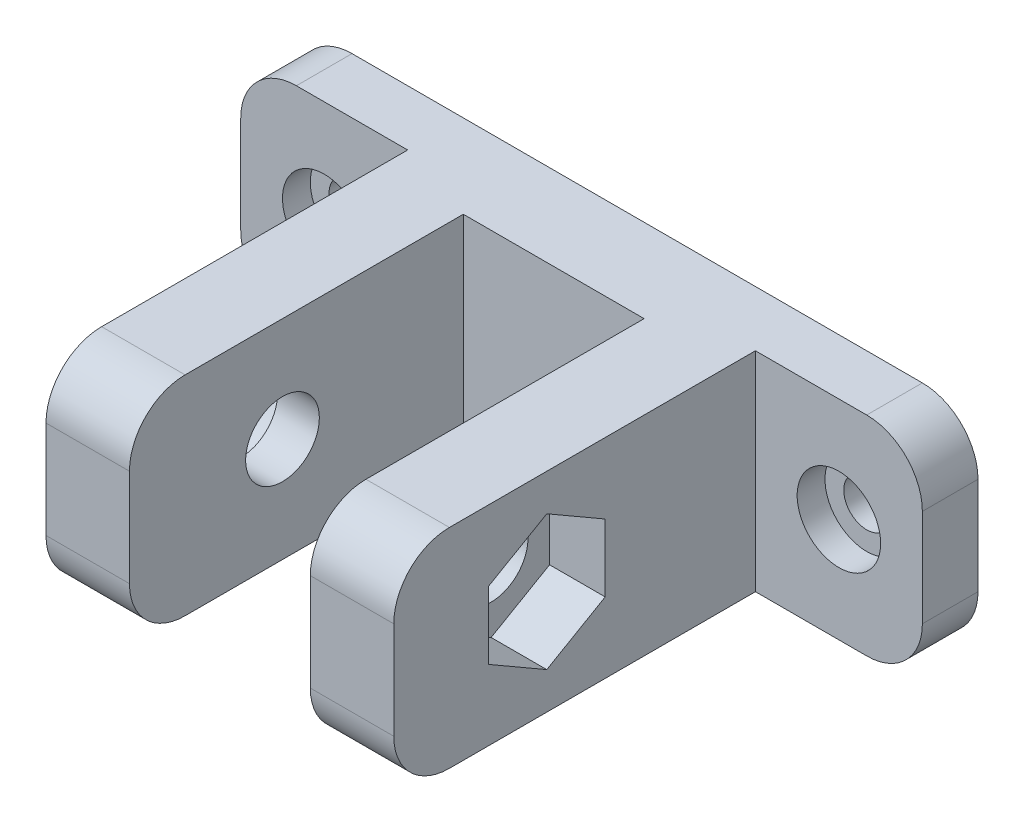
ISO-10303-21;
HEADER;
FILE_DESCRIPTION(('STEP AP214'),'2;1');
FILE_NAME('part.step','',(''),(''),'','','');
FILE_SCHEMA(('AUTOMOTIVE_DESIGN { 1 0 10303 214 1 1 1 1 }'));
ENDSEC;
DATA;
#1=APPLICATION_CONTEXT('core data for automotive mechanical design processes');
#2=APPLICATION_PROTOCOL_DEFINITION('international standard','automotive_design',2000,#1);
#3=PRODUCT_CONTEXT('',#1,'mechanical');
#4=PRODUCT('Part','Part','',(#3));
#5=PRODUCT_RELATED_PRODUCT_CATEGORY('part','',(#4));
#6=PRODUCT_DEFINITION_FORMATION('','',#4);
#7=PRODUCT_DEFINITION_CONTEXT('part definition',#1,'design');
#8=PRODUCT_DEFINITION('design','',#6,#7);
#9=PRODUCT_DEFINITION_SHAPE('','',#8);
#10=(LENGTH_UNIT() NAMED_UNIT(*) SI_UNIT(.MILLI.,.METRE.));
#11=(NAMED_UNIT(*) PLANE_ANGLE_UNIT() SI_UNIT($,.RADIAN.));
#12=(NAMED_UNIT(*) SI_UNIT($,.STERADIAN.) SOLID_ANGLE_UNIT());
#13=UNCERTAINTY_MEASURE_WITH_UNIT(LENGTH_MEASURE(1.E-05),#10,'distance_accuracy_value','');
#14=(GEOMETRIC_REPRESENTATION_CONTEXT(3) GLOBAL_UNCERTAINTY_ASSIGNED_CONTEXT((#13)) GLOBAL_UNIT_ASSIGNED_CONTEXT((#10,
#11,#12)) REPRESENTATION_CONTEXT('',''));
#15=CARTESIAN_POINT('',(0.,0.,0.));
#16=DIRECTION('',(0.,0.,1.));
#17=DIRECTION('',(1.,0.,0.));
#18=AXIS2_PLACEMENT_3D('',#15,#16,#17);
#19=CARTESIAN_POINT('',(12.5,-185.,30.7200156897307));
#20=DIRECTION('',(1.,0.,0.));
#21=DIRECTION('',(0.,0.,-1.));
#22=AXIS2_PLACEMENT_3D('',#19,#20,#21);
#23=PLANE('',#22);
#24=DIRECTION('',(0.,-1.,0.));
#25=VECTOR('',#24,1.);
#26=CARTESIAN_POINT('',(12.5,-185.,45.));
#27=LINE('',#26,#25);
#28=CARTESIAN_POINT('',(12.5,-189.,45.));
#29=VERTEX_POINT('',#28);
#30=CARTESIAN_POINT('',(12.5,-196.,45.));
#31=VERTEX_POINT('',#30);
#32=EDGE_CURVE('E456',#29,#31,#27,.T.);
#33=ORIENTED_EDGE('',*,*,#32,.T.);
#34=CARTESIAN_POINT('',(12.5,-196.,41.));
#35=DIRECTION('',(1.,0.,0.));
#36=DIRECTION('',(0.,0.,-1.));
#37=AXIS2_PLACEMENT_3D('',#34,#35,#36);
#38=CIRCLE('',#37,4.);
#39=CARTESIAN_POINT('',(12.5,-200.,41.));
#40=VERTEX_POINT('',#39);
#41=EDGE_CURVE('E509',#31,#40,#38,.T.);
#42=ORIENTED_EDGE('',*,*,#41,.T.);
#43=DIRECTION('',(0.,0.,1.));
#44=VECTOR('',#43,1.);
#45=CARTESIAN_POINT('',(12.5,-200.,30.7200156897307));
#46=LINE('',#45,#44);
#47=CARTESIAN_POINT('',(12.5,-200.,19.));
#48=VERTEX_POINT('',#47);
#49=EDGE_CURVE('E431',#48,#40,#46,.T.);
#50=ORIENTED_EDGE('',*,*,#49,.F.);
#51=DIRECTION('',(0.,-1.,0.));
#52=VECTOR('',#51,1.);
#53=CARTESIAN_POINT('',(12.5,-185.,19.));
#54=LINE('',#53,#52);
#55=CARTESIAN_POINT('',(12.5,-185.,19.));
#56=VERTEX_POINT('',#55);
#57=EDGE_CURVE('E447',#56,#48,#54,.T.);
#58=ORIENTED_EDGE('',*,*,#57,.F.);
#59=DIRECTION('',(0.,0.,1.));
#60=VECTOR('',#59,1.);
#61=CARTESIAN_POINT('',(12.5,-185.,30.7200156897307));
#62=LINE('',#61,#60);
#63=CARTESIAN_POINT('',(12.5,-185.,41.));
#64=VERTEX_POINT('',#63);
#65=EDGE_CURVE('E400',#56,#64,#62,.T.);
#66=ORIENTED_EDGE('',*,*,#65,.T.);
#67=CARTESIAN_POINT('',(12.5,-189.,41.));
#68=DIRECTION('',(1.,0.,0.));
#69=DIRECTION('',(0.,0.,-1.));
#70=AXIS2_PLACEMENT_3D('',#67,#68,#69);
#71=CIRCLE('',#70,4.);
#72=EDGE_CURVE('E506',#64,#29,#71,.T.);
#73=ORIENTED_EDGE('',*,*,#72,.T.);
#74=EDGE_LOOP('',(#33,#42,#50,#58,#66,#73));
#75=FACE_BOUND('',#74,.T.);
#76=DIRECTION('',(0.,-0.5,0.866025403784438));
#77=VECTOR('',#76,1.);
#78=CARTESIAN_POINT('',(12.5,-196.137306695894,31.9));
#79=LINE('',#78,#77);
#80=CARTESIAN_POINT('',(12.5,-194.924871130597,29.8));
#81=VERTEX_POINT('',#80);
#82=CARTESIAN_POINT('',(12.5,-197.349742261193,34.));
#83=VERTEX_POINT('',#82);
#84=EDGE_CURVE('E303',#81,#83,#79,.T.);
#85=ORIENTED_EDGE('',*,*,#84,.T.);
#86=DIRECTION('',(0.,0.5,0.866025403784439));
#87=VECTOR('',#86,1.);
#88=CARTESIAN_POINT('',(12.5,-196.137306695894,36.1));
#89=LINE('',#88,#87);
#90=CARTESIAN_POINT('',(12.5,-194.924871130597,38.2));
#91=VERTEX_POINT('',#90);
#92=EDGE_CURVE('E253',#83,#91,#89,.T.);
#93=ORIENTED_EDGE('',*,*,#92,.T.);
#94=DIRECTION('',(0.,1.,0.));
#95=VECTOR('',#94,1.);
#96=CARTESIAN_POINT('',(12.5,-192.5,38.2));
#97=LINE('',#96,#95);
#98=CARTESIAN_POINT('',(12.5,-190.075128869403,38.2));
#99=VERTEX_POINT('',#98);
#100=EDGE_CURVE('E277',#91,#99,#97,.T.);
#101=ORIENTED_EDGE('',*,*,#100,.T.);
#102=DIRECTION('',(0.,0.5,-0.866025403784438));
#103=VECTOR('',#102,1.);
#104=CARTESIAN_POINT('',(12.5,-188.862693304105,36.1));
#105=LINE('',#104,#103);
#106=CARTESIAN_POINT('',(12.5,-187.650257738807,34.));
#107=VERTEX_POINT('',#106);
#108=EDGE_CURVE('E37',#99,#107,#105,.T.);
#109=ORIENTED_EDGE('',*,*,#108,.T.);
#110=DIRECTION('',(0.,-0.5,-0.866025403784439));
#111=VECTOR('',#110,1.);
#112=CARTESIAN_POINT('',(12.5,-188.862693304105,31.9));
#113=LINE('',#112,#111);
#114=CARTESIAN_POINT('',(12.5,-190.075128869403,29.8));
#115=VERTEX_POINT('',#114);
#116=EDGE_CURVE('E310',#107,#115,#113,.T.);
#117=ORIENTED_EDGE('',*,*,#116,.T.);
#118=DIRECTION('',(0.,-1.,0.));
#119=VECTOR('',#118,1.);
#120=CARTESIAN_POINT('',(12.5,-192.5,29.8));
#121=LINE('',#120,#119);
#122=EDGE_CURVE('E306',#115,#81,#121,.T.);
#123=ORIENTED_EDGE('',*,*,#122,.T.);
#124=EDGE_LOOP('',(#85,#93,#101,#109,#117,#123));
#125=FACE_BOUND('',#124,.T.);
#126=ADVANCED_FACE('F16',(#75,#125),#23,.T.);
#127=CARTESIAN_POINT('',(12.502,-192.5,34.));
#128=DIRECTION('',(-1.,0.,0.));
#129=DIRECTION('',(0.,0.,1.));
#130=AXIS2_PLACEMENT_3D('',#127,#128,#129);
#131=CYLINDRICAL_SURFACE('',#130,2.65);
#132=CARTESIAN_POINT('',(6.5,-192.5,34.));
#133=DIRECTION('',(1.,0.,0.));
#134=DIRECTION('',(0.,0.,-1.));
#135=AXIS2_PLACEMENT_3D('',#132,#133,#134);
#136=CIRCLE('',#135,2.65);
#137=CARTESIAN_POINT('',(6.5,-192.5,31.35));
#138=VERTEX_POINT('',#137);
#139=EDGE_CURVE('E367',#138,#138,#136,.T.);
#140=ORIENTED_EDGE('',*,*,#139,.F.);
#141=EDGE_LOOP('',(#140));
#142=FACE_BOUND('',#141,.T.);
#143=CARTESIAN_POINT('',(8.5,-192.5,34.));
#144=DIRECTION('',(1.,0.,0.));
#145=DIRECTION('',(0.,0.,-1.));
#146=AXIS2_PLACEMENT_3D('',#143,#144,#145);
#147=CIRCLE('',#146,2.65);
#148=CARTESIAN_POINT('',(8.5,-192.5,31.35));
#149=VERTEX_POINT('',#148);
#150=EDGE_CURVE('E298',#149,#149,#147,.F.);
#151=ORIENTED_EDGE('',*,*,#150,.F.);
#152=EDGE_LOOP('',(#151));
#153=FACE_BOUND('',#152,.T.);
#154=ADVANCED_FACE('F679',(#142,#153),#131,.F.);
#155=CARTESIAN_POINT('',(-18.5,-192.5,14.998));
#156=DIRECTION('',(0.,0.,1.));
#157=DIRECTION('',(1.,0.,0.));
#158=AXIS2_PLACEMENT_3D('',#155,#156,#157);
#159=CYLINDRICAL_SURFACE('',#158,1.65);
#160=CARTESIAN_POINT('',(-18.5,-192.5,15.));
#161=DIRECTION('',(0.,0.,1.));
#162=DIRECTION('',(1.,0.,0.));
#163=AXIS2_PLACEMENT_3D('',#160,#161,#162);
#164=CIRCLE('',#163,1.65);
#165=CARTESIAN_POINT('',(-16.85,-192.5,15.));
#166=VERTEX_POINT('',#165);
#167=EDGE_CURVE('E352',#166,#166,#164,.F.);
#168=ORIENTED_EDGE('',*,*,#167,.T.);
#169=EDGE_LOOP('',(#168));
#170=FACE_BOUND('',#169,.T.);
#171=CARTESIAN_POINT('',(-18.5,-192.5,17.));
#172=DIRECTION('',(0.,0.,1.));
#173=DIRECTION('',(1.,0.,0.));
#174=AXIS2_PLACEMENT_3D('',#171,#172,#173);
#175=CIRCLE('',#174,1.65);
#176=CARTESIAN_POINT('',(-16.85,-192.5,17.));
#177=VERTEX_POINT('',#176);
#178=EDGE_CURVE('E328',#177,#177,#175,.T.);
#179=ORIENTED_EDGE('',*,*,#178,.T.);
#180=EDGE_LOOP('',(#179));
#181=FACE_BOUND('',#180,.T.);
#182=ADVANCED_FACE('F684',(#170,#181),#159,.F.);
#183=CARTESIAN_POINT('',(18.5,-192.5,14.998));
#184=DIRECTION('',(0.,0.,1.));
#185=DIRECTION('',(1.,0.,0.));
#186=AXIS2_PLACEMENT_3D('',#183,#184,#185);
#187=CYLINDRICAL_SURFACE('',#186,1.65);
#188=CARTESIAN_POINT('',(18.5,-192.5,15.));
#189=DIRECTION('',(0.,0.,1.));
#190=DIRECTION('',(1.,0.,0.));
#191=AXIS2_PLACEMENT_3D('',#188,#189,#190);
#192=CIRCLE('',#191,1.65);
#193=CARTESIAN_POINT('',(20.15,-192.5,15.));
#194=VERTEX_POINT('',#193);
#195=EDGE_CURVE('E337',#194,#194,#192,.F.);
#196=ORIENTED_EDGE('',*,*,#195,.T.);
#197=EDGE_LOOP('',(#196));
#198=FACE_BOUND('',#197,.T.);
#199=CARTESIAN_POINT('',(18.5,-192.5,17.));
#200=DIRECTION('',(0.,0.,1.));
#201=DIRECTION('',(1.,0.,0.));
#202=AXIS2_PLACEMENT_3D('',#199,#200,#201);
#203=CIRCLE('',#202,1.65);
#204=CARTESIAN_POINT('',(20.15,-192.5,17.));
#205=VERTEX_POINT('',#204);
#206=EDGE_CURVE('E342',#205,#205,#203,.T.);
#207=ORIENTED_EDGE('',*,*,#206,.T.);
#208=EDGE_LOOP('',(#207));
#209=FACE_BOUND('',#208,.T.);
#210=ADVANCED_FACE('F709',(#198,#209),#187,.F.);
#211=CARTESIAN_POINT('',(0.,-185.,15.));
#212=DIRECTION('',(0.,0.,1.));
#213=DIRECTION('',(1.,0.,0.));
#214=AXIS2_PLACEMENT_3D('',#211,#212,#213);
#215=PLANE('',#214);
#216=ORIENTED_EDGE('',*,*,#167,.F.);
#217=EDGE_LOOP('',(#216));
#218=FACE_BOUND('',#217,.T.);
#219=ORIENTED_EDGE('',*,*,#195,.F.);
#220=EDGE_LOOP('',(#219));
#221=FACE_BOUND('',#220,.T.);
#222=DIRECTION('',(0.,-1.,0.));
#223=VECTOR('',#222,1.);
#224=CARTESIAN_POINT('',(24.5,-185.,15.));
#225=LINE('',#224,#223);
#226=CARTESIAN_POINT('',(24.5,-189.,15.));
#227=VERTEX_POINT('',#226);
#228=CARTESIAN_POINT('',(24.5,-196.,15.));
#229=VERTEX_POINT('',#228);
#230=EDGE_CURVE('E446',#227,#229,#225,.T.);
#231=ORIENTED_EDGE('',*,*,#230,.T.);
#232=CARTESIAN_POINT('',(20.5,-196.,15.));
#233=DIRECTION('',(0.,0.,1.));
#234=DIRECTION('',(1.,0.,0.));
#235=AXIS2_PLACEMENT_3D('',#232,#233,#234);
#236=CIRCLE('',#235,4.);
#237=CARTESIAN_POINT('',(20.5,-200.,15.));
#238=VERTEX_POINT('',#237);
#239=EDGE_CURVE('E567',#229,#238,#236,.F.);
#240=ORIENTED_EDGE('',*,*,#239,.T.);
#241=DIRECTION('',(-1.,0.,0.));
#242=VECTOR('',#241,1.);
#243=CARTESIAN_POINT('',(0.,-200.,15.));
#244=LINE('',#243,#242);
#245=CARTESIAN_POINT('',(-20.5,-200.,15.));
#246=VERTEX_POINT('',#245);
#247=EDGE_CURVE('E376',#238,#246,#244,.T.);
#248=ORIENTED_EDGE('',*,*,#247,.T.);
#249=CARTESIAN_POINT('',(-20.5,-196.,15.));
#250=DIRECTION('',(0.,0.,1.));
#251=DIRECTION('',(1.,0.,0.));
#252=AXIS2_PLACEMENT_3D('',#249,#250,#251);
#253=CIRCLE('',#252,4.);
#254=CARTESIAN_POINT('',(-24.5,-196.,15.));
#255=VERTEX_POINT('',#254);
#256=EDGE_CURVE('E564',#246,#255,#253,.F.);
#257=ORIENTED_EDGE('',*,*,#256,.T.);
#258=DIRECTION('',(0.,-1.,0.));
#259=VECTOR('',#258,1.);
#260=CARTESIAN_POINT('',(-24.5,-185.,15.));
#261=LINE('',#260,#259);
#262=CARTESIAN_POINT('',(-24.5,-189.,15.));
#263=VERTEX_POINT('',#262);
#264=EDGE_CURVE('E412',#263,#255,#261,.T.);
#265=ORIENTED_EDGE('',*,*,#264,.F.);
#266=CARTESIAN_POINT('',(-20.5,-189.,15.));
#267=DIRECTION('',(0.,0.,1.));
#268=DIRECTION('',(1.,0.,0.));
#269=AXIS2_PLACEMENT_3D('',#266,#267,#268);
#270=CIRCLE('',#269,4.);
#271=CARTESIAN_POINT('',(-20.5,-185.,15.));
#272=VERTEX_POINT('',#271);
#273=EDGE_CURVE('E558',#263,#272,#270,.F.);
#274=ORIENTED_EDGE('',*,*,#273,.T.);
#275=DIRECTION('',(-1.,0.,0.));
#276=VECTOR('',#275,1.);
#277=CARTESIAN_POINT('',(0.,-185.,15.));
#278=LINE('',#277,#276);
#279=CARTESIAN_POINT('',(20.5,-185.,15.));
#280=VERTEX_POINT('',#279);
#281=EDGE_CURVE('E380',#280,#272,#278,.T.);
#282=ORIENTED_EDGE('',*,*,#281,.F.);
#283=CARTESIAN_POINT('',(20.5,-189.,15.));
#284=DIRECTION('',(0.,0.,1.));
#285=DIRECTION('',(1.,0.,0.));
#286=AXIS2_PLACEMENT_3D('',#283,#284,#285);
#287=CIRCLE('',#286,4.);
#288=EDGE_CURVE('E561',#280,#227,#287,.F.);
#289=ORIENTED_EDGE('',*,*,#288,.T.);
#290=EDGE_LOOP('',(#231,#240,#248,#257,#265,#274,#282,#289));
#291=FACE_BOUND('',#290,.T.);
#292=ADVANCED_FACE('F656',(#218,#221,#291),#215,.F.);
#293=CARTESIAN_POINT('',(24.5,-185.,17.3310513421893));
#294=DIRECTION('',(1.,0.,0.));
#295=DIRECTION('',(0.,0.,-1.));
#296=AXIS2_PLACEMENT_3D('',#293,#294,#295);
#297=PLANE('',#296);
#298=DIRECTION('',(0.,-1.,0.));
#299=VECTOR('',#298,1.);
#300=CARTESIAN_POINT('',(24.5,-185.,19.));
#301=LINE('',#300,#299);
#302=CARTESIAN_POINT('',(24.5,-189.,19.));
#303=VERTEX_POINT('',#302);
#304=CARTESIAN_POINT('',(24.5,-196.,19.));
#305=VERTEX_POINT('',#304);
#306=EDGE_CURVE('E442',#303,#305,#301,.T.);
#307=ORIENTED_EDGE('',*,*,#306,.T.);
#308=DIRECTION('',(0.,0.,1.));
#309=VECTOR('',#308,1.);
#310=CARTESIAN_POINT('',(24.5,-196.,17.3310513421893));
#311=LINE('',#310,#309);
#312=EDGE_CURVE('E555',#305,#229,#311,.F.);
#313=ORIENTED_EDGE('',*,*,#312,.T.);
#314=ORIENTED_EDGE('',*,*,#230,.F.);
#315=DIRECTION('',(0.,0.,1.));
#316=VECTOR('',#315,1.);
#317=CARTESIAN_POINT('',(24.5,-189.,19.));
#318=LINE('',#317,#316);
#319=EDGE_CURVE('E551',#227,#303,#318,.T.);
#320=ORIENTED_EDGE('',*,*,#319,.T.);
#321=EDGE_LOOP('',(#307,#313,#314,#320));
#322=FACE_BOUND('',#321,.T.);
#323=ADVANCED_FACE('F659',(#322),#297,.T.);
#324=CARTESIAN_POINT('',(20.3781006336212,-185.,19.));
#325=DIRECTION('',(0.,0.,-1.));
#326=DIRECTION('',(-1.,0.,0.));
#327=AXIS2_PLACEMENT_3D('',#324,#325,#326);
#328=PLANE('',#327);
#329=CARTESIAN_POINT('',(18.5,-192.5,19.));
#330=DIRECTION('',(0.,0.,1.));
#331=DIRECTION('',(1.,0.,0.));
#332=AXIS2_PLACEMENT_3D('',#329,#330,#331);
#333=CIRCLE('',#332,3.);
#334=CARTESIAN_POINT('',(21.5,-192.5,19.));
#335=VERTEX_POINT('',#334);
#336=EDGE_CURVE('E258',#335,#335,#333,.T.);
#337=ORIENTED_EDGE('',*,*,#336,.F.);
#338=EDGE_LOOP('',(#337));
#339=FACE_BOUND('',#338,.T.);
#340=DIRECTION('',(1.,0.,0.));
#341=VECTOR('',#340,1.);
#342=CARTESIAN_POINT('',(20.3781006336212,-200.,19.));
#343=LINE('',#342,#341);
#344=CARTESIAN_POINT('',(20.5,-200.,19.));
#345=VERTEX_POINT('',#344);
#346=EDGE_CURVE('E385',#48,#345,#343,.T.);
#347=ORIENTED_EDGE('',*,*,#346,.T.);
#348=CARTESIAN_POINT('',(20.5,-196.,19.));
#349=DIRECTION('',(0.,0.,-1.));
#350=DIRECTION('',(-1.,0.,0.));
#351=AXIS2_PLACEMENT_3D('',#348,#349,#350);
#352=CIRCLE('',#351,4.);
#353=EDGE_CURVE('E548',#345,#305,#352,.F.);
#354=ORIENTED_EDGE('',*,*,#353,.T.);
#355=ORIENTED_EDGE('',*,*,#306,.F.);
#356=CARTESIAN_POINT('',(20.5,-189.,19.));
#357=DIRECTION('',(0.,0.,-1.));
#358=DIRECTION('',(-1.,0.,0.));
#359=AXIS2_PLACEMENT_3D('',#356,#357,#358);
#360=CIRCLE('',#359,4.);
#361=CARTESIAN_POINT('',(20.5,-185.,19.));
#362=VERTEX_POINT('',#361);
#363=EDGE_CURVE('E545',#303,#362,#360,.F.);
#364=ORIENTED_EDGE('',*,*,#363,.T.);
#365=DIRECTION('',(1.,0.,0.));
#366=VECTOR('',#365,1.);
#367=CARTESIAN_POINT('',(20.3781006336212,-185.,19.));
#368=LINE('',#367,#366);
#369=EDGE_CURVE('E408',#56,#362,#368,.T.);
#370=ORIENTED_EDGE('',*,*,#369,.F.);
#371=ORIENTED_EDGE('',*,*,#57,.T.);
#372=EDGE_LOOP('',(#347,#354,#355,#364,#370,#371));
#373=FACE_BOUND('',#372,.T.);
#374=ADVANCED_FACE('F646',(#339,#373),#328,.F.);
#375=CARTESIAN_POINT('',(11.8818525224924,-185.,45.));
#376=DIRECTION('',(0.,0.,1.));
#377=DIRECTION('',(1.,0.,0.));
#378=AXIS2_PLACEMENT_3D('',#375,#376,#377);
#379=PLANE('',#378);
#380=DIRECTION('',(0.,-1.,0.));
#381=VECTOR('',#380,1.);
#382=CARTESIAN_POINT('',(6.5,-185.,45.));
#383=LINE('',#382,#381);
#384=CARTESIAN_POINT('',(6.5,-189.,45.));
#385=VERTEX_POINT('',#384);
#386=CARTESIAN_POINT('',(6.5,-196.,45.));
#387=VERTEX_POINT('',#386);
#388=EDGE_CURVE('E452',#385,#387,#383,.T.);
#389=ORIENTED_EDGE('',*,*,#388,.T.);
#390=DIRECTION('',(-1.,0.,0.));
#391=VECTOR('',#390,1.);
#392=CARTESIAN_POINT('',(11.8818525224924,-196.,45.));
#393=LINE('',#392,#391);
#394=EDGE_CURVE('E503',#387,#31,#393,.F.);
#395=ORIENTED_EDGE('',*,*,#394,.T.);
#396=ORIENTED_EDGE('',*,*,#32,.F.);
#397=DIRECTION('',(-1.,0.,0.));
#398=VECTOR('',#397,1.);
#399=CARTESIAN_POINT('',(6.5,-189.,45.));
#400=LINE('',#399,#398);
#401=EDGE_CURVE('E499',#29,#385,#400,.T.);
#402=ORIENTED_EDGE('',*,*,#401,.T.);
#403=EDGE_LOOP('',(#389,#395,#396,#402));
#404=FACE_BOUND('',#403,.T.);
#405=ADVANCED_FACE('F636',(#404),#379,.T.);
#406=CARTESIAN_POINT('',(6.5,-185.,30.7200156897307));
#407=DIRECTION('',(1.,0.,0.));
#408=DIRECTION('',(0.,0.,-1.));
#409=AXIS2_PLACEMENT_3D('',#406,#407,#408);
#410=PLANE('',#409);
#411=ORIENTED_EDGE('',*,*,#139,.T.);
#412=EDGE_LOOP('',(#411));
#413=FACE_BOUND('',#412,.T.);
#414=DIRECTION('',(0.,0.,1.));
#415=VECTOR('',#414,1.);
#416=CARTESIAN_POINT('',(6.5,-200.,30.7200156897307));
#417=LINE('',#416,#415);
#418=CARTESIAN_POINT('',(6.5,-200.,21.));
#419=VERTEX_POINT('',#418);
#420=CARTESIAN_POINT('',(6.5,-200.,41.));
#421=VERTEX_POINT('',#420);
#422=EDGE_CURVE('E435',#419,#421,#417,.T.);
#423=ORIENTED_EDGE('',*,*,#422,.T.);
#424=CARTESIAN_POINT('',(6.5,-196.,41.));
#425=DIRECTION('',(1.,0.,0.));
#426=DIRECTION('',(0.,0.,-1.));
#427=AXIS2_PLACEMENT_3D('',#424,#425,#426);
#428=CIRCLE('',#427,4.);
#429=EDGE_CURVE('E496',#421,#387,#428,.F.);
#430=ORIENTED_EDGE('',*,*,#429,.T.);
#431=ORIENTED_EDGE('',*,*,#388,.F.);
#432=CARTESIAN_POINT('',(6.5,-189.,41.));
#433=DIRECTION('',(1.,0.,0.));
#434=DIRECTION('',(0.,0.,-1.));
#435=AXIS2_PLACEMENT_3D('',#432,#433,#434);
#436=CIRCLE('',#435,4.);
#437=CARTESIAN_POINT('',(6.5,-185.,41.));
#438=VERTEX_POINT('',#437);
#439=EDGE_CURVE('E493',#385,#438,#436,.F.);
#440=ORIENTED_EDGE('',*,*,#439,.T.);
#441=DIRECTION('',(0.,0.,1.));
#442=VECTOR('',#441,1.);
#443=CARTESIAN_POINT('',(6.5,-185.,30.7200156897307));
#444=LINE('',#443,#442);
#445=CARTESIAN_POINT('',(6.5,-185.,21.));
#446=VERTEX_POINT('',#445);
#447=EDGE_CURVE('E404',#446,#438,#444,.T.);
#448=ORIENTED_EDGE('',*,*,#447,.F.);
#449=DIRECTION('',(0.,-1.,0.));
#450=VECTOR('',#449,1.);
#451=CARTESIAN_POINT('',(6.5,-185.,21.));
#452=LINE('',#451,#450);
#453=EDGE_CURVE('E457',#446,#419,#452,.T.);
#454=ORIENTED_EDGE('',*,*,#453,.T.);
#455=EDGE_LOOP('',(#423,#430,#431,#440,#448,#454));
#456=FACE_BOUND('',#455,.T.);
#457=ADVANCED_FACE('F693',(#413,#456),#410,.F.);
#458=CARTESIAN_POINT('',(3.93924576928839,-185.,21.));
#459=DIRECTION('',(0.,0.,-1.));
#460=DIRECTION('',(-1.,0.,0.));
#461=AXIS2_PLACEMENT_3D('',#458,#459,#460);
#462=PLANE('',#461);
#463=DIRECTION('',(1.,0.,0.));
#464=VECTOR('',#463,1.);
#465=CARTESIAN_POINT('',(3.93924576928839,-200.,21.));
#466=LINE('',#465,#464);
#467=CARTESIAN_POINT('',(-6.5,-200.,21.));
#468=VERTEX_POINT('',#467);
#469=EDGE_CURVE('E421',#468,#419,#466,.T.);
#470=ORIENTED_EDGE('',*,*,#469,.T.);
#471=ORIENTED_EDGE('',*,*,#453,.F.);
#472=DIRECTION('',(1.,0.,0.));
#473=VECTOR('',#472,1.);
#474=CARTESIAN_POINT('',(3.93924576928839,-185.,21.));
#475=LINE('',#474,#473);
#476=CARTESIAN_POINT('',(-6.5,-185.,21.));
#477=VERTEX_POINT('',#476);
#478=EDGE_CURVE('E390',#477,#446,#475,.T.);
#479=ORIENTED_EDGE('',*,*,#478,.F.);
#480=DIRECTION('',(0.,-1.,0.));
#481=VECTOR('',#480,1.);
#482=CARTESIAN_POINT('',(-6.5,-185.,21.));
#483=LINE('',#482,#481);
#484=EDGE_CURVE('E465',#477,#468,#483,.T.);
#485=ORIENTED_EDGE('',*,*,#484,.T.);
#486=EDGE_LOOP('',(#470,#471,#479,#485));
#487=FACE_BOUND('',#486,.T.);
#488=ADVANCED_FACE('F621',(#487),#462,.F.);
#489=CARTESIAN_POINT('',(-6.5,-185.,31.1738789826632));
#490=DIRECTION('',(1.,0.,0.));
#491=DIRECTION('',(0.,0.,-1.));
#492=AXIS2_PLACEMENT_3D('',#489,#490,#491);
#493=PLANE('',#492);
#494=CARTESIAN_POINT('',(-6.5,-192.5,34.));
#495=DIRECTION('',(1.,0.,0.));
#496=DIRECTION('',(0.,0.,-1.));
#497=AXIS2_PLACEMENT_3D('',#494,#495,#496);
#498=CIRCLE('',#497,2.65);
#499=CARTESIAN_POINT('',(-6.5,-192.5,31.35));
#500=VERTEX_POINT('',#499);
#501=EDGE_CURVE('E363',#500,#500,#498,.T.);
#502=ORIENTED_EDGE('',*,*,#501,.F.);
#503=EDGE_LOOP('',(#502));
#504=FACE_BOUND('',#503,.T.);
#505=DIRECTION('',(0.,-1.,0.));
#506=VECTOR('',#505,1.);
#507=CARTESIAN_POINT('',(-6.5,-185.,45.));
#508=LINE('',#507,#506);
#509=CARTESIAN_POINT('',(-6.5,-189.,45.));
#510=VERTEX_POINT('',#509);
#511=CARTESIAN_POINT('',(-6.5,-196.,45.));
#512=VERTEX_POINT('',#511);
#513=EDGE_CURVE('E470',#510,#512,#508,.T.);
#514=ORIENTED_EDGE('',*,*,#513,.T.);
#515=CARTESIAN_POINT('',(-6.5,-196.,41.));
#516=DIRECTION('',(1.,0.,0.));
#517=DIRECTION('',(0.,0.,-1.));
#518=AXIS2_PLACEMENT_3D('',#515,#516,#517);
#519=CIRCLE('',#518,4.);
#520=CARTESIAN_POINT('',(-6.5,-200.,41.));
#521=VERTEX_POINT('',#520);
#522=EDGE_CURVE('E522',#512,#521,#519,.T.);
#523=ORIENTED_EDGE('',*,*,#522,.T.);
#524=DIRECTION('',(0.,0.,1.));
#525=VECTOR('',#524,1.);
#526=CARTESIAN_POINT('',(-6.5,-200.,31.1738789826632));
#527=LINE('',#526,#525);
#528=EDGE_CURVE('E422',#468,#521,#527,.T.);
#529=ORIENTED_EDGE('',*,*,#528,.F.);
#530=ORIENTED_EDGE('',*,*,#484,.F.);
#531=DIRECTION('',(0.,0.,1.));
#532=VECTOR('',#531,1.);
#533=CARTESIAN_POINT('',(-6.5,-185.,31.1738789826632));
#534=LINE('',#533,#532);
#535=CARTESIAN_POINT('',(-6.5,-185.,41.));
#536=VERTEX_POINT('',#535);
#537=EDGE_CURVE('E391',#477,#536,#534,.T.);
#538=ORIENTED_EDGE('',*,*,#537,.T.);
#539=CARTESIAN_POINT('',(-6.5,-189.,41.));
#540=DIRECTION('',(1.,0.,0.));
#541=DIRECTION('',(0.,0.,-1.));
#542=AXIS2_PLACEMENT_3D('',#539,#540,#541);
#543=CIRCLE('',#542,4.);
#544=EDGE_CURVE('E519',#536,#510,#543,.T.);
#545=ORIENTED_EDGE('',*,*,#544,.T.);
#546=EDGE_LOOP('',(#514,#523,#529,#530,#538,#545));
#547=FACE_BOUND('',#546,.T.);
#548=ADVANCED_FACE('F606',(#504,#547),#493,.T.);
#549=CARTESIAN_POINT('',(-1.67064897203818,-185.,45.));
#550=DIRECTION('',(0.,0.,-1.));
#551=DIRECTION('',(-1.,0.,0.));
#552=AXIS2_PLACEMENT_3D('',#549,#550,#551);
#553=PLANE('',#552);
#554=DIRECTION('',(0.,-1.,0.));
#555=VECTOR('',#554,1.);
#556=CARTESIAN_POINT('',(-12.5,-185.,45.));
#557=LINE('',#556,#555);
#558=CARTESIAN_POINT('',(-12.5,-189.,45.));
#559=VERTEX_POINT('',#558);
#560=CARTESIAN_POINT('',(-12.5,-196.,45.));
#561=VERTEX_POINT('',#560);
#562=EDGE_CURVE('E466',#559,#561,#557,.T.);
#563=ORIENTED_EDGE('',*,*,#562,.T.);
#564=DIRECTION('',(1.,0.,0.));
#565=VECTOR('',#564,1.);
#566=CARTESIAN_POINT('',(-6.5,-196.,45.));
#567=LINE('',#566,#565);
#568=EDGE_CURVE('E515',#561,#512,#567,.T.);
#569=ORIENTED_EDGE('',*,*,#568,.T.);
#570=ORIENTED_EDGE('',*,*,#513,.F.);
#571=DIRECTION('',(1.,0.,0.));
#572=VECTOR('',#571,1.);
#573=CARTESIAN_POINT('',(-1.67064897203818,-189.,45.));
#574=LINE('',#573,#572);
#575=EDGE_CURVE('E512',#510,#559,#574,.F.);
#576=ORIENTED_EDGE('',*,*,#575,.T.);
#577=EDGE_LOOP('',(#563,#569,#570,#576));
#578=FACE_BOUND('',#577,.T.);
#579=ADVANCED_FACE('F608',(#578),#553,.F.);
#580=CARTESIAN_POINT('',(-12.5,-185.,31.1738789826632));
#581=DIRECTION('',(1.,0.,0.));
#582=DIRECTION('',(0.,0.,-1.));
#583=AXIS2_PLACEMENT_3D('',#580,#581,#582);
#584=PLANE('',#583);
#585=CARTESIAN_POINT('',(-12.5,-192.5,34.));
#586=DIRECTION('',(-1.,0.,0.));
#587=DIRECTION('',(0.,-1.,0.));
#588=AXIS2_PLACEMENT_3D('',#585,#586,#587);
#589=CIRCLE('',#588,4.5);
#590=CARTESIAN_POINT('',(-12.5,-197.,34.));
#591=VERTEX_POINT('',#590);
#592=EDGE_CURVE('E371',#591,#591,#589,.T.);
#593=ORIENTED_EDGE('',*,*,#592,.F.);
#594=EDGE_LOOP('',(#593));
#595=FACE_BOUND('',#594,.T.);
#596=DIRECTION('',(0.,0.,1.));
#597=VECTOR('',#596,1.);
#598=CARTESIAN_POINT('',(-12.5,-200.,31.1738789826632));
#599=LINE('',#598,#597);
#600=CARTESIAN_POINT('',(-12.5,-200.,19.));
#601=VERTEX_POINT('',#600);
#602=CARTESIAN_POINT('',(-12.5,-200.,41.));
#603=VERTEX_POINT('',#602);
#604=EDGE_CURVE('E417',#601,#603,#599,.T.);
#605=ORIENTED_EDGE('',*,*,#604,.T.);
#606=CARTESIAN_POINT('',(-12.5,-196.,41.));
#607=DIRECTION('',(1.,0.,0.));
#608=DIRECTION('',(0.,0.,-1.));
#609=AXIS2_PLACEMENT_3D('',#606,#607,#608);
#610=CIRCLE('',#609,4.);
#611=EDGE_CURVE('E528',#603,#561,#610,.F.);
#612=ORIENTED_EDGE('',*,*,#611,.T.);
#613=ORIENTED_EDGE('',*,*,#562,.F.);
#614=CARTESIAN_POINT('',(-12.5,-189.,41.));
#615=DIRECTION('',(1.,0.,0.));
#616=DIRECTION('',(0.,0.,-1.));
#617=AXIS2_PLACEMENT_3D('',#614,#615,#616);
#618=CIRCLE('',#617,4.);
#619=CARTESIAN_POINT('',(-12.5,-185.,41.));
#620=VERTEX_POINT('',#619);
#621=EDGE_CURVE('E525',#559,#620,#618,.F.);
#622=ORIENTED_EDGE('',*,*,#621,.T.);
#623=DIRECTION('',(0.,0.,1.));
#624=VECTOR('',#623,1.);
#625=CARTESIAN_POINT('',(-12.5,-185.,31.1738789826632));
#626=LINE('',#625,#624);
#627=CARTESIAN_POINT('',(-12.5,-185.,19.));
#628=VERTEX_POINT('',#627);
#629=EDGE_CURVE('E386',#628,#620,#626,.T.);
#630=ORIENTED_EDGE('',*,*,#629,.F.);
#631=DIRECTION('',(0.,-1.,0.));
#632=VECTOR('',#631,1.);
#633=CARTESIAN_POINT('',(-12.5,-185.,19.));
#634=LINE('',#633,#632);
#635=EDGE_CURVE('E471',#628,#601,#634,.T.);
#636=ORIENTED_EDGE('',*,*,#635,.T.);
#637=EDGE_LOOP('',(#605,#612,#613,#622,#630,#636));
#638=FACE_BOUND('',#637,.T.);
#639=ADVANCED_FACE('F596',(#595,#638),#584,.F.);
#640=CARTESIAN_POINT('',(-12.0367403142154,-185.,19.));
#641=DIRECTION('',(0.,0.,-1.));
#642=DIRECTION('',(-1.,0.,0.));
#643=AXIS2_PLACEMENT_3D('',#640,#641,#642);
#644=PLANE('',#643);
#645=CARTESIAN_POINT('',(-18.5,-192.5,19.));
#646=DIRECTION('',(0.,0.,1.));
#647=DIRECTION('',(1.,0.,0.));
#648=AXIS2_PLACEMENT_3D('',#645,#646,#647);
#649=CIRCLE('',#648,3.);
#650=CARTESIAN_POINT('',(-15.5,-192.5,19.));
#651=VERTEX_POINT('',#650);
#652=EDGE_CURVE('E333',#651,#651,#649,.T.);
#653=ORIENTED_EDGE('',*,*,#652,.F.);
#654=EDGE_LOOP('',(#653));
#655=FACE_BOUND('',#654,.T.);
#656=DIRECTION('',(0.,-1.,0.));
#657=VECTOR('',#656,1.);
#658=CARTESIAN_POINT('',(-24.5,-185.,19.));
#659=LINE('',#658,#657);
#660=CARTESIAN_POINT('',(-24.5,-189.,19.));
#661=VERTEX_POINT('',#660);
#662=CARTESIAN_POINT('',(-24.5,-196.,19.));
#663=VERTEX_POINT('',#662);
#664=EDGE_CURVE('E480',#661,#663,#659,.T.);
#665=ORIENTED_EDGE('',*,*,#664,.T.);
#666=CARTESIAN_POINT('',(-20.5,-196.,19.));
#667=DIRECTION('',(0.,0.,-1.));
#668=DIRECTION('',(-1.,0.,0.));
#669=AXIS2_PLACEMENT_3D('',#666,#667,#668);
#670=CIRCLE('',#669,4.);
#671=CARTESIAN_POINT('',(-20.5,-200.,19.));
#672=VERTEX_POINT('',#671);
#673=EDGE_CURVE('E579',#663,#672,#670,.F.);
#674=ORIENTED_EDGE('',*,*,#673,.T.);
#675=DIRECTION('',(1.,0.,0.));
#676=VECTOR('',#675,1.);
#677=CARTESIAN_POINT('',(-12.0367403142154,-200.,19.));
#678=LINE('',#677,#676);
#679=EDGE_CURVE('E416',#672,#601,#678,.T.);
#680=ORIENTED_EDGE('',*,*,#679,.T.);
#681=ORIENTED_EDGE('',*,*,#635,.F.);
#682=DIRECTION('',(1.,0.,0.));
#683=VECTOR('',#682,1.);
#684=CARTESIAN_POINT('',(-12.0367403142154,-185.,19.));
#685=LINE('',#684,#683);
#686=CARTESIAN_POINT('',(-20.5,-185.,19.));
#687=VERTEX_POINT('',#686);
#688=EDGE_CURVE('E384',#687,#628,#685,.T.);
#689=ORIENTED_EDGE('',*,*,#688,.F.);
#690=CARTESIAN_POINT('',(-20.5,-189.,19.));
#691=DIRECTION('',(0.,0.,-1.));
#692=DIRECTION('',(-1.,0.,0.));
#693=AXIS2_PLACEMENT_3D('',#690,#691,#692);
#694=CIRCLE('',#693,4.);
#695=EDGE_CURVE('E49',#687,#661,#694,.F.);
#696=ORIENTED_EDGE('',*,*,#695,.T.);
#697=EDGE_LOOP('',(#665,#674,#680,#681,#689,#696));
#698=FACE_BOUND('',#697,.T.);
#699=ADVANCED_FACE('F590',(#655,#698),#644,.F.);
#700=CARTESIAN_POINT('',(-24.5,-185.,17.7849146351218));
#701=DIRECTION('',(1.,0.,0.));
#702=DIRECTION('',(0.,0.,-1.));
#703=AXIS2_PLACEMENT_3D('',#700,#701,#702);
#704=PLANE('',#703);
#705=ORIENTED_EDGE('',*,*,#264,.T.);
#706=DIRECTION('',(0.,0.,1.));
#707=VECTOR('',#706,1.);
#708=CARTESIAN_POINT('',(-24.5,-196.,19.));
#709=LINE('',#708,#707);
#710=EDGE_CURVE('E573',#255,#663,#709,.T.);
#711=ORIENTED_EDGE('',*,*,#710,.T.);
#712=ORIENTED_EDGE('',*,*,#664,.F.);
#713=DIRECTION('',(0.,0.,1.));
#714=VECTOR('',#713,1.);
#715=CARTESIAN_POINT('',(-24.5,-189.,17.7849146351218));
#716=LINE('',#715,#714);
#717=EDGE_CURVE('E570',#661,#263,#716,.F.);
#718=ORIENTED_EDGE('',*,*,#717,.T.);
#719=EDGE_LOOP('',(#705,#711,#712,#718));
#720=FACE_BOUND('',#719,.T.);
#721=ADVANCED_FACE('F670',(#720),#704,.F.);
#722=CARTESIAN_POINT('',(1.11022302462516E-13,-185.,22.5));
#723=DIRECTION('',(0.,-1.,0.));
#724=DIRECTION('',(1.,0.,0.));
#725=AXIS2_PLACEMENT_3D('',#722,#723,#724);
#726=PLANE('',#725);
#727=ORIENTED_EDGE('',*,*,#369,.T.);
#728=DIRECTION('',(0.,0.,1.));
#729=VECTOR('',#728,1.);
#730=CARTESIAN_POINT('',(20.5,-185.,15.));
#731=LINE('',#730,#729);
#732=EDGE_CURVE('E10',#362,#280,#731,.F.);
#733=ORIENTED_EDGE('',*,*,#732,.T.);
#734=ORIENTED_EDGE('',*,*,#281,.T.);
#735=DIRECTION('',(0.,0.,1.));
#736=VECTOR('',#735,1.);
#737=CARTESIAN_POINT('',(-20.5,-185.,22.5));
#738=LINE('',#737,#736);
#739=EDGE_CURVE('E25',#272,#687,#738,.T.);
#740=ORIENTED_EDGE('',*,*,#739,.T.);
#741=ORIENTED_EDGE('',*,*,#688,.T.);
#742=ORIENTED_EDGE('',*,*,#629,.T.);
#743=DIRECTION('',(1.,0.,0.));
#744=VECTOR('',#743,1.);
#745=CARTESIAN_POINT('',(1.11022302462516E-13,-185.,41.));
#746=LINE('',#745,#744);
#747=EDGE_CURVE('E531',#620,#536,#746,.T.);
#748=ORIENTED_EDGE('',*,*,#747,.T.);
#749=ORIENTED_EDGE('',*,*,#537,.F.);
#750=ORIENTED_EDGE('',*,*,#478,.T.);
#751=ORIENTED_EDGE('',*,*,#447,.T.);
#752=DIRECTION('',(-1.,0.,0.));
#753=VECTOR('',#752,1.);
#754=CARTESIAN_POINT('',(12.5,-185.,41.));
#755=LINE('',#754,#753);
#756=EDGE_CURVE('E535',#438,#64,#755,.F.);
#757=ORIENTED_EDGE('',*,*,#756,.T.);
#758=ORIENTED_EDGE('',*,*,#65,.F.);
#759=EDGE_LOOP('',(#727,#733,#734,#740,#741,#742,#748,#749,#750,#751,#757,#758));
#760=FACE_BOUND('',#759,.T.);
#761=ADVANCED_FACE('F585',(#760),#726,.F.);
#762=CARTESIAN_POINT('',(1.11022302462516E-13,-200.,22.5));
#763=DIRECTION('',(0.,-1.,0.));
#764=DIRECTION('',(1.,0.,0.));
#765=AXIS2_PLACEMENT_3D('',#762,#763,#764);
#766=PLANE('',#765);
#767=ORIENTED_EDGE('',*,*,#247,.F.);
#768=DIRECTION('',(0.,0.,1.));
#769=VECTOR('',#768,1.);
#770=CARTESIAN_POINT('',(20.5,-200.,22.5));
#771=LINE('',#770,#769);
#772=EDGE_CURVE('E541',#238,#345,#771,.T.);
#773=ORIENTED_EDGE('',*,*,#772,.T.);
#774=ORIENTED_EDGE('',*,*,#346,.F.);
#775=ORIENTED_EDGE('',*,*,#49,.T.);
#776=DIRECTION('',(-1.,0.,0.));
#777=VECTOR('',#776,1.);
#778=CARTESIAN_POINT('',(1.08756705884093E-13,-200.,41.));
#779=LINE('',#778,#777);
#780=EDGE_CURVE('E489',#40,#421,#779,.T.);
#781=ORIENTED_EDGE('',*,*,#780,.T.);
#782=ORIENTED_EDGE('',*,*,#422,.F.);
#783=ORIENTED_EDGE('',*,*,#469,.F.);
#784=ORIENTED_EDGE('',*,*,#528,.T.);
#785=DIRECTION('',(1.,0.,0.));
#786=VECTOR('',#785,1.);
#787=CARTESIAN_POINT('',(-12.5,-200.,41.));
#788=LINE('',#787,#786);
#789=EDGE_CURVE('E451',#521,#603,#788,.F.);
#790=ORIENTED_EDGE('',*,*,#789,.T.);
#791=ORIENTED_EDGE('',*,*,#604,.F.);
#792=ORIENTED_EDGE('',*,*,#679,.F.);
#793=DIRECTION('',(0.,0.,1.));
#794=VECTOR('',#793,1.);
#795=CARTESIAN_POINT('',(-20.5,-200.,15.));
#796=LINE('',#795,#794);
#797=EDGE_CURVE('E538',#672,#246,#796,.F.);
#798=ORIENTED_EDGE('',*,*,#797,.T.);
#799=EDGE_LOOP('',(#767,#773,#774,#775,#781,#782,#783,#784,#790,#791,#792,#798));
#800=FACE_BOUND('',#799,.T.);
#801=ADVANCED_FACE('F618',(#800),#766,.T.);
#802=CARTESIAN_POINT('',(-9.5,-192.5,34.));
#803=DIRECTION('',(-1.,0.,0.));
#804=DIRECTION('',(0.,0.,1.));
#805=AXIS2_PLACEMENT_3D('',#802,#803,#804);
#806=CYLINDRICAL_SURFACE('',#805,4.5);
#807=CARTESIAN_POINT('',(-9.5,-192.5,34.));
#808=DIRECTION('',(-1.,0.,0.));
#809=DIRECTION('',(0.,-1.,0.));
#810=AXIS2_PLACEMENT_3D('',#807,#808,#809);
#811=CIRCLE('',#810,4.5);
#812=CARTESIAN_POINT('',(-9.5,-197.,34.));
#813=VERTEX_POINT('',#812);
#814=EDGE_CURVE('E372',#813,#813,#811,.T.);
#815=ORIENTED_EDGE('',*,*,#814,.F.);
#816=EDGE_LOOP('',(#815));
#817=FACE_BOUND('',#816,.T.);
#818=ORIENTED_EDGE('',*,*,#592,.T.);
#819=EDGE_LOOP('',(#818));
#820=FACE_BOUND('',#819,.T.);
#821=ADVANCED_FACE('F751',(#817,#820),#806,.F.);
#822=CARTESIAN_POINT('',(-9.5,-192.5,32.));
#823=DIRECTION('',(-1.,0.,0.));
#824=DIRECTION('',(0.,-1.,0.));
#825=AXIS2_PLACEMENT_3D('',#822,#823,#824);
#826=PLANE('',#825);
#827=CARTESIAN_POINT('',(-9.5,-192.5,34.));
#828=DIRECTION('',(-1.,0.,0.));
#829=DIRECTION('',(0.,0.,1.));
#830=AXIS2_PLACEMENT_3D('',#827,#828,#829);
#831=CIRCLE('',#830,2.65);
#832=CARTESIAN_POINT('',(-9.5,-192.5,36.65));
#833=VERTEX_POINT('',#832);
#834=EDGE_CURVE('E356',#833,#833,#831,.T.);
#835=ORIENTED_EDGE('',*,*,#834,.F.);
#836=EDGE_LOOP('',(#835));
#837=FACE_BOUND('',#836,.T.);
#838=ORIENTED_EDGE('',*,*,#814,.T.);
#839=EDGE_LOOP('',(#838));
#840=FACE_BOUND('',#839,.T.);
#841=ADVANCED_FACE('F849',(#837,#840),#826,.T.);
#842=ORIENTED_EDGE('',*,*,#501,.T.);
#843=EDGE_LOOP('',(#842));
#844=FACE_BOUND('',#843,.T.);
#845=ORIENTED_EDGE('',*,*,#834,.T.);
#846=EDGE_LOOP('',(#845));
#847=FACE_BOUND('',#846,.T.);
#848=ADVANCED_FACE('F687',(#844,#847),#131,.F.);
#849=CARTESIAN_POINT('',(1.08756705884093E-13,-196.,41.));
#850=DIRECTION('',(-1.,0.,0.));
#851=DIRECTION('',(0.,0.,1.));
#852=AXIS2_PLACEMENT_3D('',#849,#850,#851);
#853=CYLINDRICAL_SURFACE('',#852,4.);
#854=ORIENTED_EDGE('',*,*,#41,.F.);
#855=ORIENTED_EDGE('',*,*,#394,.F.);
#856=ORIENTED_EDGE('',*,*,#429,.F.);
#857=ORIENTED_EDGE('',*,*,#780,.F.);
#858=EDGE_LOOP('',(#854,#855,#856,#857));
#859=FACE_BOUND('',#858,.T.);
#860=ADVANCED_FACE('F640',(#859),#853,.T.);
#861=CARTESIAN_POINT('',(-1.67064897203818,-196.,41.));
#862=DIRECTION('',(-1.,0.,0.));
#863=DIRECTION('',(0.,0.,1.));
#864=AXIS2_PLACEMENT_3D('',#861,#862,#863);
#865=CYLINDRICAL_SURFACE('',#864,4.);
#866=ORIENTED_EDGE('',*,*,#611,.F.);
#867=ORIENTED_EDGE('',*,*,#789,.F.);
#868=ORIENTED_EDGE('',*,*,#522,.F.);
#869=ORIENTED_EDGE('',*,*,#568,.F.);
#870=EDGE_LOOP('',(#866,#867,#868,#869));
#871=FACE_BOUND('',#870,.T.);
#872=ADVANCED_FACE('F612',(#871),#865,.T.);
#873=CARTESIAN_POINT('',(11.8818525224924,-189.,41.));
#874=DIRECTION('',(1.,0.,0.));
#875=DIRECTION('',(0.,0.,-1.));
#876=AXIS2_PLACEMENT_3D('',#873,#874,#875);
#877=CYLINDRICAL_SURFACE('',#876,4.);
#878=ORIENTED_EDGE('',*,*,#72,.F.);
#879=ORIENTED_EDGE('',*,*,#756,.F.);
#880=ORIENTED_EDGE('',*,*,#439,.F.);
#881=ORIENTED_EDGE('',*,*,#401,.F.);
#882=EDGE_LOOP('',(#878,#879,#880,#881));
#883=FACE_BOUND('',#882,.T.);
#884=ADVANCED_FACE('F629',(#883),#877,.T.);
#885=CARTESIAN_POINT('',(1.11022302462516E-13,-189.,41.));
#886=DIRECTION('',(1.,0.,0.));
#887=DIRECTION('',(0.,0.,-1.));
#888=AXIS2_PLACEMENT_3D('',#885,#886,#887);
#889=CYLINDRICAL_SURFACE('',#888,4.);
#890=ORIENTED_EDGE('',*,*,#621,.F.);
#891=ORIENTED_EDGE('',*,*,#575,.F.);
#892=ORIENTED_EDGE('',*,*,#544,.F.);
#893=ORIENTED_EDGE('',*,*,#747,.F.);
#894=EDGE_LOOP('',(#890,#891,#892,#893));
#895=FACE_BOUND('',#894,.T.);
#896=ADVANCED_FACE('F602',(#895),#889,.T.);
#897=CARTESIAN_POINT('',(18.5,-192.5,17.));
#898=DIRECTION('',(0.,0.,1.));
#899=DIRECTION('',(1.,0.,0.));
#900=AXIS2_PLACEMENT_3D('',#897,#898,#899);
#901=CYLINDRICAL_SURFACE('',#900,3.);
#902=CARTESIAN_POINT('',(18.5,-192.5,17.));
#903=DIRECTION('',(0.,0.,1.));
#904=DIRECTION('',(1.,0.,0.));
#905=AXIS2_PLACEMENT_3D('',#902,#903,#904);
#906=CIRCLE('',#905,3.);
#907=CARTESIAN_POINT('',(21.5,-192.5,17.));
#908=VERTEX_POINT('',#907);
#909=EDGE_CURVE('E341',#908,#908,#906,.T.);
#910=ORIENTED_EDGE('',*,*,#909,.F.);
#911=EDGE_LOOP('',(#910));
#912=FACE_BOUND('',#911,.T.);
#913=ORIENTED_EDGE('',*,*,#336,.T.);
#914=EDGE_LOOP('',(#913));
#915=FACE_BOUND('',#914,.T.);
#916=ADVANCED_FACE('F719',(#912,#915),#901,.F.);
#917=CARTESIAN_POINT('',(-1.49999999999998,-192.5,17.));
#918=DIRECTION('',(0.,0.,1.));
#919=DIRECTION('',(1.,0.,0.));
#920=AXIS2_PLACEMENT_3D('',#917,#918,#919);
#921=PLANE('',#920);
#922=ORIENTED_EDGE('',*,*,#206,.F.);
#923=EDGE_LOOP('',(#922));
#924=FACE_BOUND('',#923,.T.);
#925=ORIENTED_EDGE('',*,*,#909,.T.);
#926=EDGE_LOOP('',(#925));
#927=FACE_BOUND('',#926,.T.);
#928=ADVANCED_FACE('F808',(#924,#927),#921,.T.);
#929=CARTESIAN_POINT('',(-18.5,-192.5,17.));
#930=DIRECTION('',(0.,0.,1.));
#931=DIRECTION('',(1.,0.,0.));
#932=AXIS2_PLACEMENT_3D('',#929,#930,#931);
#933=CYLINDRICAL_SURFACE('',#932,3.);
#934=CARTESIAN_POINT('',(-18.5,-192.5,17.));
#935=DIRECTION('',(0.,0.,1.));
#936=DIRECTION('',(1.,0.,0.));
#937=AXIS2_PLACEMENT_3D('',#934,#935,#936);
#938=CIRCLE('',#937,3.);
#939=CARTESIAN_POINT('',(-15.5,-192.5,17.));
#940=VERTEX_POINT('',#939);
#941=EDGE_CURVE('E332',#940,#940,#938,.T.);
#942=ORIENTED_EDGE('',*,*,#941,.F.);
#943=EDGE_LOOP('',(#942));
#944=FACE_BOUND('',#943,.T.);
#945=ORIENTED_EDGE('',*,*,#652,.T.);
#946=EDGE_LOOP('',(#945));
#947=FACE_BOUND('',#946,.T.);
#948=ADVANCED_FACE('F804',(#944,#947),#933,.F.);
#949=CARTESIAN_POINT('',(-1.49999999999998,-192.5,17.));
#950=DIRECTION('',(0.,0.,1.));
#951=DIRECTION('',(1.,0.,0.));
#952=AXIS2_PLACEMENT_3D('',#949,#950,#951);
#953=PLANE('',#952);
#954=ORIENTED_EDGE('',*,*,#178,.F.);
#955=EDGE_LOOP('',(#954));
#956=FACE_BOUND('',#955,.T.);
#957=ORIENTED_EDGE('',*,*,#941,.T.);
#958=EDGE_LOOP('',(#957));
#959=FACE_BOUND('',#958,.T.);
#960=ADVANCED_FACE('F722',(#956,#959),#953,.T.);
#961=CARTESIAN_POINT('',(20.5,-196.,22.5));
#962=DIRECTION('',(0.,0.,1.));
#963=DIRECTION('',(1.,0.,0.));
#964=AXIS2_PLACEMENT_3D('',#961,#962,#963);
#965=CYLINDRICAL_SURFACE('',#964,4.);
#966=ORIENTED_EDGE('',*,*,#239,.F.);
#967=ORIENTED_EDGE('',*,*,#312,.F.);
#968=ORIENTED_EDGE('',*,*,#353,.F.);
#969=ORIENTED_EDGE('',*,*,#772,.F.);
#970=EDGE_LOOP('',(#966,#967,#968,#969));
#971=FACE_BOUND('',#970,.T.);
#972=ADVANCED_FACE('F662',(#971),#965,.T.);
#973=CARTESIAN_POINT('',(-20.5,-196.,17.7849146351218));
#974=DIRECTION('',(0.,0.,-1.));
#975=DIRECTION('',(-1.,0.,0.));
#976=AXIS2_PLACEMENT_3D('',#973,#974,#975);
#977=CYLINDRICAL_SURFACE('',#976,4.);
#978=ORIENTED_EDGE('',*,*,#256,.F.);
#979=ORIENTED_EDGE('',*,*,#797,.F.);
#980=ORIENTED_EDGE('',*,*,#673,.F.);
#981=ORIENTED_EDGE('',*,*,#710,.F.);
#982=EDGE_LOOP('',(#978,#979,#980,#981));
#983=FACE_BOUND('',#982,.T.);
#984=ADVANCED_FACE('F666',(#983),#977,.T.);
#985=CARTESIAN_POINT('',(20.5,-189.,17.3310513421893));
#986=DIRECTION('',(0.,0.,-1.));
#987=DIRECTION('',(-1.,0.,0.));
#988=AXIS2_PLACEMENT_3D('',#985,#986,#987);
#989=CYLINDRICAL_SURFACE('',#988,4.);
#990=ORIENTED_EDGE('',*,*,#288,.F.);
#991=ORIENTED_EDGE('',*,*,#732,.F.);
#992=ORIENTED_EDGE('',*,*,#363,.F.);
#993=ORIENTED_EDGE('',*,*,#319,.F.);
#994=EDGE_LOOP('',(#990,#991,#992,#993));
#995=FACE_BOUND('',#994,.T.);
#996=ADVANCED_FACE('F652',(#995),#989,.T.);
#997=CARTESIAN_POINT('',(-20.5,-189.,22.5));
#998=DIRECTION('',(0.,0.,1.));
#999=DIRECTION('',(1.,0.,0.));
#1000=AXIS2_PLACEMENT_3D('',#997,#998,#999);
#1001=CYLINDRICAL_SURFACE('',#1000,4.);
#1002=ORIENTED_EDGE('',*,*,#273,.F.);
#1003=ORIENTED_EDGE('',*,*,#717,.F.);
#1004=ORIENTED_EDGE('',*,*,#695,.F.);
#1005=ORIENTED_EDGE('',*,*,#739,.F.);
#1006=EDGE_LOOP('',(#1002,#1003,#1004,#1005));
#1007=FACE_BOUND('',#1006,.T.);
#1008=ADVANCED_FACE('F18',(#1007),#1001,.T.);
#1009=CARTESIAN_POINT('',(8.5,-196.137306695894,36.1));
#1010=DIRECTION('',(0.,0.866025403784439,-0.5));
#1011=DIRECTION('',(0.,0.5,0.866025403784439));
#1012=AXIS2_PLACEMENT_3D('',#1009,#1010,#1011);
#1013=PLANE('',#1012);
#1014=ORIENTED_EDGE('',*,*,#92,.F.);
#1015=DIRECTION('',(1.,0.,0.));
#1016=VECTOR('',#1015,1.);
#1017=CARTESIAN_POINT('',(8.5,-197.349742261193,34.));
#1018=LINE('',#1017,#1016);
#1019=CARTESIAN_POINT('',(8.5,-197.349742261193,34.));
#1020=VERTEX_POINT('',#1019);
#1021=EDGE_CURVE('E247',#1020,#83,#1018,.T.);
#1022=ORIENTED_EDGE('',*,*,#1021,.F.);
#1023=DIRECTION('',(0.,0.5,0.866025403784439));
#1024=VECTOR('',#1023,1.);
#1025=CARTESIAN_POINT('',(8.5,-196.137306695894,36.1));
#1026=LINE('',#1025,#1024);
#1027=CARTESIAN_POINT('',(8.5,-194.924871130597,38.2));
#1028=VERTEX_POINT('',#1027);
#1029=EDGE_CURVE('E251',#1020,#1028,#1026,.T.);
#1030=ORIENTED_EDGE('',*,*,#1029,.T.);
#1031=DIRECTION('',(1.,0.,0.));
#1032=VECTOR('',#1031,1.);
#1033=CARTESIAN_POINT('',(8.5,-194.924871130597,38.2));
#1034=LINE('',#1033,#1032);
#1035=EDGE_CURVE('E301',#1028,#91,#1034,.T.);
#1036=ORIENTED_EDGE('',*,*,#1035,.T.);
#1037=EDGE_LOOP('',(#1014,#1022,#1030,#1036));
#1038=FACE_BOUND('',#1037,.T.);
#1039=ADVANCED_FACE('F249',(#1038),#1013,.T.);
#1040=CARTESIAN_POINT('',(8.5,-196.137306695894,31.9));
#1041=DIRECTION('',(0.,0.866025403784438,0.5));
#1042=DIRECTION('',(0.,-0.5,0.866025403784438));
#1043=AXIS2_PLACEMENT_3D('',#1040,#1041,#1042);
#1044=PLANE('',#1043);
#1045=ORIENTED_EDGE('',*,*,#84,.F.);
#1046=DIRECTION('',(1.,0.,0.));
#1047=VECTOR('',#1046,1.);
#1048=CARTESIAN_POINT('',(8.5,-194.924871130597,29.8));
#1049=LINE('',#1048,#1047);
#1050=CARTESIAN_POINT('',(8.5,-194.924871130597,29.8));
#1051=VERTEX_POINT('',#1050);
#1052=EDGE_CURVE('E259',#1051,#81,#1049,.T.);
#1053=ORIENTED_EDGE('',*,*,#1052,.F.);
#1054=DIRECTION('',(0.,-0.5,0.866025403784438));
#1055=VECTOR('',#1054,1.);
#1056=CARTESIAN_POINT('',(8.5,-196.137306695894,31.9));
#1057=LINE('',#1056,#1055);
#1058=EDGE_CURVE('E262',#1051,#1020,#1057,.T.);
#1059=ORIENTED_EDGE('',*,*,#1058,.T.);
#1060=ORIENTED_EDGE('',*,*,#1021,.T.);
#1061=EDGE_LOOP('',(#1045,#1053,#1059,#1060));
#1062=FACE_BOUND('',#1061,.T.);
#1063=ADVANCED_FACE('F263',(#1062),#1044,.T.);
#1064=CARTESIAN_POINT('',(8.5,-192.5,29.8));
#1065=DIRECTION('',(0.,0.,1.));
#1066=DIRECTION('',(1.,0.,0.));
#1067=AXIS2_PLACEMENT_3D('',#1064,#1065,#1066);
#1068=PLANE('',#1067);
#1069=ORIENTED_EDGE('',*,*,#122,.F.);
#1070=DIRECTION('',(1.,0.,0.));
#1071=VECTOR('',#1070,1.);
#1072=CARTESIAN_POINT('',(8.5,-190.075128869403,29.8));
#1073=LINE('',#1072,#1071);
#1074=CARTESIAN_POINT('',(8.5,-190.075128869403,29.8));
#1075=VERTEX_POINT('',#1074);
#1076=EDGE_CURVE('E323',#1075,#115,#1073,.T.);
#1077=ORIENTED_EDGE('',*,*,#1076,.F.);
#1078=DIRECTION('',(0.,-1.,0.));
#1079=VECTOR('',#1078,1.);
#1080=CARTESIAN_POINT('',(8.5,-192.5,29.8));
#1081=LINE('',#1080,#1079);
#1082=EDGE_CURVE('E268',#1075,#1051,#1081,.T.);
#1083=ORIENTED_EDGE('',*,*,#1082,.T.);
#1084=ORIENTED_EDGE('',*,*,#1052,.T.);
#1085=EDGE_LOOP('',(#1069,#1077,#1083,#1084));
#1086=FACE_BOUND('',#1085,.T.);
#1087=ADVANCED_FACE('F943',(#1086),#1068,.T.);
#1088=CARTESIAN_POINT('',(8.5,-188.862693304105,31.9));
#1089=DIRECTION('',(0.,-0.866025403784439,0.5));
#1090=DIRECTION('',(0.,-0.5,-0.866025403784439));
#1091=AXIS2_PLACEMENT_3D('',#1088,#1089,#1090);
#1092=PLANE('',#1091);
#1093=ORIENTED_EDGE('',*,*,#116,.F.);
#1094=DIRECTION('',(1.,0.,0.));
#1095=VECTOR('',#1094,1.);
#1096=CARTESIAN_POINT('',(8.5,-187.650257738807,34.));
#1097=LINE('',#1096,#1095);
#1098=CARTESIAN_POINT('',(8.5,-187.650257738807,34.));
#1099=VERTEX_POINT('',#1098);
#1100=EDGE_CURVE('E320',#1099,#107,#1097,.T.);
#1101=ORIENTED_EDGE('',*,*,#1100,.F.);
#1102=DIRECTION('',(0.,-0.5,-0.866025403784439));
#1103=VECTOR('',#1102,1.);
#1104=CARTESIAN_POINT('',(8.5,-188.862693304105,31.9));
#1105=LINE('',#1104,#1103);
#1106=EDGE_CURVE('E288',#1099,#1075,#1105,.T.);
#1107=ORIENTED_EDGE('',*,*,#1106,.T.);
#1108=ORIENTED_EDGE('',*,*,#1076,.T.);
#1109=EDGE_LOOP('',(#1093,#1101,#1107,#1108));
#1110=FACE_BOUND('',#1109,.T.);
#1111=ADVANCED_FACE('F946',(#1110),#1092,.T.);
#1112=CARTESIAN_POINT('',(8.5,-188.862693304105,36.1));
#1113=DIRECTION('',(0.,-0.866025403784438,-0.5));
#1114=DIRECTION('',(0.,0.5,-0.866025403784438));
#1115=AXIS2_PLACEMENT_3D('',#1112,#1113,#1114);
#1116=PLANE('',#1115);
#1117=ORIENTED_EDGE('',*,*,#108,.F.);
#1118=DIRECTION('',(1.,0.,0.));
#1119=VECTOR('',#1118,1.);
#1120=CARTESIAN_POINT('',(8.5,-190.075128869403,38.2));
#1121=LINE('',#1120,#1119);
#1122=CARTESIAN_POINT('',(8.5,-190.075128869403,38.2));
#1123=VERTEX_POINT('',#1122);
#1124=EDGE_CURVE('E317',#1123,#99,#1121,.T.);
#1125=ORIENTED_EDGE('',*,*,#1124,.F.);
#1126=DIRECTION('',(0.,0.5,-0.866025403784438));
#1127=VECTOR('',#1126,1.);
#1128=CARTESIAN_POINT('',(8.5,-188.862693304105,36.1));
#1129=LINE('',#1128,#1127);
#1130=EDGE_CURVE('E292',#1123,#1099,#1129,.T.);
#1131=ORIENTED_EDGE('',*,*,#1130,.T.);
#1132=ORIENTED_EDGE('',*,*,#1100,.T.);
#1133=EDGE_LOOP('',(#1117,#1125,#1131,#1132));
#1134=FACE_BOUND('',#1133,.T.);
#1135=ADVANCED_FACE('F950',(#1134),#1116,.T.);
#1136=CARTESIAN_POINT('',(8.5,-192.5,38.2));
#1137=DIRECTION('',(0.,0.,-1.));
#1138=DIRECTION('',(-1.,0.,0.));
#1139=AXIS2_PLACEMENT_3D('',#1136,#1137,#1138);
#1140=PLANE('',#1139);
#1141=ORIENTED_EDGE('',*,*,#100,.F.);
#1142=ORIENTED_EDGE('',*,*,#1035,.F.);
#1143=DIRECTION('',(0.,1.,0.));
#1144=VECTOR('',#1143,1.);
#1145=CARTESIAN_POINT('',(8.5,-192.5,38.2));
#1146=LINE('',#1145,#1144);
#1147=EDGE_CURVE('E275',#1028,#1123,#1146,.T.);
#1148=ORIENTED_EDGE('',*,*,#1147,.T.);
#1149=ORIENTED_EDGE('',*,*,#1124,.T.);
#1150=EDGE_LOOP('',(#1141,#1142,#1148,#1149));
#1151=FACE_BOUND('',#1150,.T.);
#1152=ADVANCED_FACE('F954',(#1151),#1140,.T.);
#1153=CARTESIAN_POINT('',(8.5,-192.5,32.));
#1154=DIRECTION('',(1.,0.,0.));
#1155=DIRECTION('',(0.,1.,0.));
#1156=AXIS2_PLACEMENT_3D('',#1153,#1154,#1155);
#1157=PLANE('',#1156);
#1158=ORIENTED_EDGE('',*,*,#1029,.F.);
#1159=ORIENTED_EDGE('',*,*,#1058,.F.);
#1160=ORIENTED_EDGE('',*,*,#1082,.F.);
#1161=ORIENTED_EDGE('',*,*,#1106,.F.);
#1162=ORIENTED_EDGE('',*,*,#1130,.F.);
#1163=ORIENTED_EDGE('',*,*,#1147,.F.);
#1164=EDGE_LOOP('',(#1158,#1159,#1160,#1161,#1162,#1163));
#1165=FACE_BOUND('',#1164,.T.);
#1166=ORIENTED_EDGE('',*,*,#150,.T.);
#1167=EDGE_LOOP('',(#1166));
#1168=FACE_BOUND('',#1167,.T.);
#1169=ADVANCED_FACE('F271',(#1165,#1168),#1157,.T.);
#1170=CLOSED_SHELL('',(#126,#154,#182,#210,#292,#323,#374,#405,#457,#488,#548,#579,#639,#699,
#721,#761,#801,#821,#841,#848,#860,#872,#884,#896,#916,#928,#948,#960,#972,#984,#996,#1008,
#1039,#1063,#1087,#1111,#1135,#1152,#1169));
#1171=MANIFOLD_SOLID_BREP('B1',#1170);
#1172=ADVANCED_BREP_SHAPE_REPRESENTATION('',(#18,#1171),#14);
#1173=SHAPE_DEFINITION_REPRESENTATION(#9,#1172);
ENDSEC;
END-ISO-10303-21;
